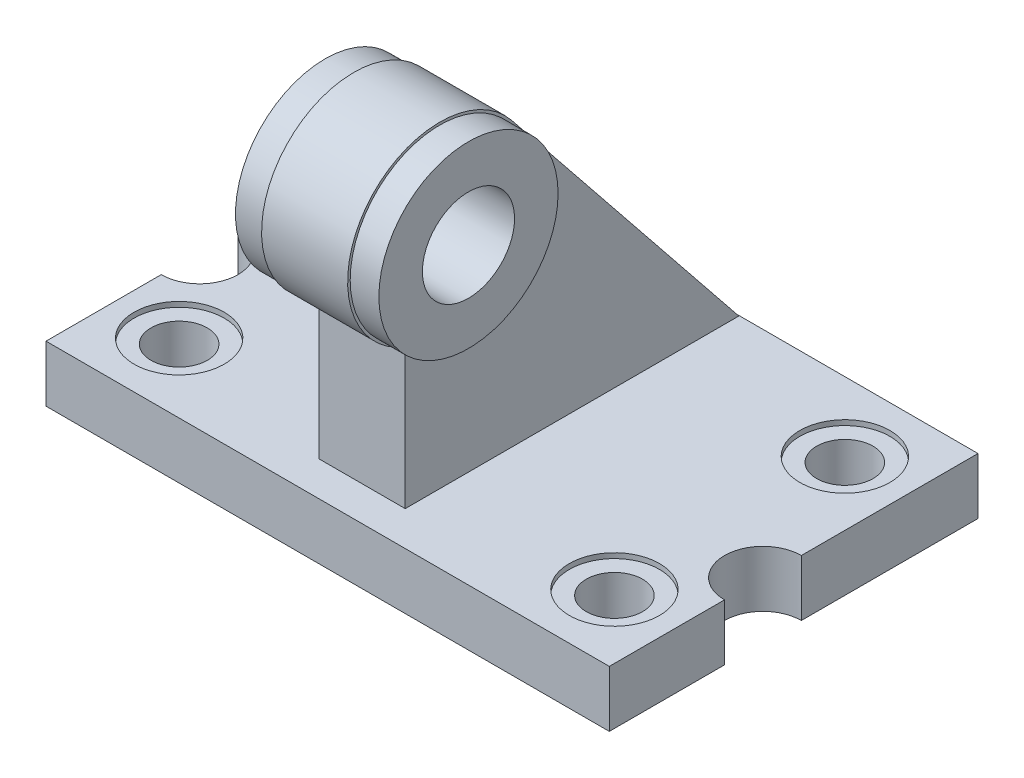
ISO-10303-21;
HEADER;
FILE_DESCRIPTION(('STEP AP214'),'2;1');
FILE_NAME('part.step','',(''),(''),'','','');
FILE_SCHEMA(('AUTOMOTIVE_DESIGN { 1 0 10303 214 1 1 1 1 }'));
ENDSEC;
DATA;
#1=APPLICATION_CONTEXT('core data for automotive mechanical design processes');
#2=APPLICATION_PROTOCOL_DEFINITION('international standard','automotive_design',2000,#1);
#3=PRODUCT_CONTEXT('',#1,'mechanical');
#4=PRODUCT('Part','Part','',(#3));
#5=PRODUCT_RELATED_PRODUCT_CATEGORY('part','',(#4));
#6=PRODUCT_DEFINITION_FORMATION('','',#4);
#7=PRODUCT_DEFINITION_CONTEXT('part definition',#1,'design');
#8=PRODUCT_DEFINITION('design','',#6,#7);
#9=PRODUCT_DEFINITION_SHAPE('','',#8);
#10=(LENGTH_UNIT() NAMED_UNIT(*) SI_UNIT(.MILLI.,.METRE.));
#11=(NAMED_UNIT(*) PLANE_ANGLE_UNIT() SI_UNIT($,.RADIAN.));
#12=(NAMED_UNIT(*) SI_UNIT($,.STERADIAN.) SOLID_ANGLE_UNIT());
#13=UNCERTAINTY_MEASURE_WITH_UNIT(LENGTH_MEASURE(1.E-05),#10,'distance_accuracy_value','');
#14=(GEOMETRIC_REPRESENTATION_CONTEXT(3) GLOBAL_UNCERTAINTY_ASSIGNED_CONTEXT((#13)) GLOBAL_UNIT_ASSIGNED_CONTEXT((#10,
#11,#12)) REPRESENTATION_CONTEXT('',''));
#15=CARTESIAN_POINT('',(0.,0.,0.));
#16=DIRECTION('',(0.,0.,1.));
#17=DIRECTION('',(1.,0.,0.));
#18=AXIS2_PLACEMENT_3D('',#15,#16,#17);
#19=CARTESIAN_POINT('',(-55.,0.,13.5));
#20=DIRECTION('',(0.,-1.,0.));
#21=DIRECTION('',(0.,0.,-1.));
#22=AXIS2_PLACEMENT_3D('',#19,#20,#21);
#23=PLANE('',#22);
#24=CARTESIAN_POINT('',(-42.5,0.,-45.));
#25=DIRECTION('',(0.,-1.,0.));
#26=DIRECTION('',(1.,0.,0.));
#27=AXIS2_PLACEMENT_3D('',#24,#25,#26);
#28=CIRCLE('',#27,5.5);
#29=CARTESIAN_POINT('',(-37.,0.,-45.));
#30=VERTEX_POINT('',#29);
#31=EDGE_CURVE('E224',#30,#30,#28,.F.);
#32=ORIENTED_EDGE('',*,*,#31,.T.);
#33=EDGE_LOOP('',(#32));
#34=FACE_BOUND('',#33,.T.);
#35=CARTESIAN_POINT('',(-42.5,0.,0.));
#36=DIRECTION('',(0.,-1.,0.));
#37=DIRECTION('',(1.,0.,0.));
#38=AXIS2_PLACEMENT_3D('',#35,#36,#37);
#39=CIRCLE('',#38,5.5);
#40=CARTESIAN_POINT('',(-37.,0.,0.));
#41=VERTEX_POINT('',#40);
#42=EDGE_CURVE('E221',#41,#41,#39,.F.);
#43=ORIENTED_EDGE('',*,*,#42,.T.);
#44=EDGE_LOOP('',(#43));
#45=FACE_BOUND('',#44,.T.);
#46=CARTESIAN_POINT('',(42.5,0.,0.));
#47=DIRECTION('',(0.,-1.,0.));
#48=DIRECTION('',(1.,0.,0.));
#49=AXIS2_PLACEMENT_3D('',#46,#47,#48);
#50=CIRCLE('',#49,5.5);
#51=CARTESIAN_POINT('',(48.,0.,0.));
#52=VERTEX_POINT('',#51);
#53=EDGE_CURVE('E218',#52,#52,#50,.F.);
#54=ORIENTED_EDGE('',*,*,#53,.T.);
#55=EDGE_LOOP('',(#54));
#56=FACE_BOUND('',#55,.T.);
#57=CARTESIAN_POINT('',(42.5,0.,-45.));
#58=DIRECTION('',(0.,-1.,0.));
#59=DIRECTION('',(1.,0.,0.));
#60=AXIS2_PLACEMENT_3D('',#57,#58,#59);
#61=CIRCLE('',#60,5.5);
#62=CARTESIAN_POINT('',(48.,0.,-45.));
#63=VERTEX_POINT('',#62);
#64=EDGE_CURVE('E215',#63,#63,#61,.F.);
#65=ORIENTED_EDGE('',*,*,#64,.T.);
#66=EDGE_LOOP('',(#65));
#67=FACE_BOUND('',#66,.T.);
#68=DIRECTION('',(0.,0.,1.));
#69=VECTOR('',#68,1.);
#70=CARTESIAN_POINT('',(-55.,0.,-22.5));
#71=LINE('',#70,#69);
#72=CARTESIAN_POINT('',(-55.,0.,-9.));
#73=VERTEX_POINT('',#72);
#74=CARTESIAN_POINT('',(-55.,0.,13.5));
#75=VERTEX_POINT('',#74);
#76=EDGE_CURVE('E134',#73,#75,#71,.T.);
#77=ORIENTED_EDGE('',*,*,#76,.F.);
#78=CARTESIAN_POINT('',(-55.,0.,-16.5));
#79=DIRECTION('',(0.,-1.,0.));
#80=DIRECTION('',(0.,0.,1.));
#81=AXIS2_PLACEMENT_3D('',#78,#79,#80);
#82=CIRCLE('',#81,7.5);
#83=CARTESIAN_POINT('',(-55.,0.,-24.));
#84=VERTEX_POINT('',#83);
#85=EDGE_CURVE('E122',#84,#73,#82,.T.);
#86=ORIENTED_EDGE('',*,*,#85,.F.);
#87=CARTESIAN_POINT('',(-55.,0.,-58.5));
#88=VERTEX_POINT('',#87);
#89=EDGE_CURVE('E142',#88,#84,#71,.T.);
#90=ORIENTED_EDGE('',*,*,#89,.F.);
#91=DIRECTION('',(-1.,0.,0.));
#92=VECTOR('',#91,1.);
#93=CARTESIAN_POINT('',(0.,0.,-58.5));
#94=LINE('',#93,#92);
#95=CARTESIAN_POINT('',(55.,0.,-58.5));
#96=VERTEX_POINT('',#95);
#97=EDGE_CURVE('E262',#96,#88,#94,.T.);
#98=ORIENTED_EDGE('',*,*,#97,.F.);
#99=DIRECTION('',(0.,0.,-1.));
#100=VECTOR('',#99,1.);
#101=CARTESIAN_POINT('',(55.,0.,-22.5));
#102=LINE('',#101,#100);
#103=CARTESIAN_POINT('',(55.,0.,-24.));
#104=VERTEX_POINT('',#103);
#105=EDGE_CURVE('E269',#104,#96,#102,.T.);
#106=ORIENTED_EDGE('',*,*,#105,.F.);
#107=CARTESIAN_POINT('',(55.,0.,-16.5));
#108=DIRECTION('',(0.,1.,0.));
#109=DIRECTION('',(0.,0.,1.));
#110=AXIS2_PLACEMENT_3D('',#107,#108,#109);
#111=CIRCLE('',#110,7.5);
#112=CARTESIAN_POINT('',(55.,0.,-9.));
#113=VERTEX_POINT('',#112);
#114=EDGE_CURVE('E137',#104,#113,#111,.T.);
#115=ORIENTED_EDGE('',*,*,#114,.T.);
#116=CARTESIAN_POINT('',(55.,0.,13.5));
#117=VERTEX_POINT('',#116);
#118=EDGE_CURVE('E240',#117,#113,#102,.T.);
#119=ORIENTED_EDGE('',*,*,#118,.F.);
#120=DIRECTION('',(1.,0.,0.));
#121=VECTOR('',#120,1.);
#122=CARTESIAN_POINT('',(0.,0.,13.5));
#123=LINE('',#122,#121);
#124=EDGE_CURVE('E140',#75,#117,#123,.T.);
#125=ORIENTED_EDGE('',*,*,#124,.F.);
#126=EDGE_LOOP('',(#77,#86,#90,#98,#106,#115,#119,#125));
#127=FACE_BOUND('',#126,.T.);
#128=ADVANCED_FACE('F36',(#34,#45,#56,#67,#127),#23,.T.);
#129=CARTESIAN_POINT('',(-55.,0.,-58.5));
#130=DIRECTION('',(-1.,0.,0.));
#131=DIRECTION('',(0.,0.,1.));
#132=AXIS2_PLACEMENT_3D('',#129,#130,#131);
#133=PLANE('',#132);
#134=DIRECTION('',(0.,0.,1.));
#135=VECTOR('',#134,1.);
#136=CARTESIAN_POINT('',(-55.,11.,-22.5));
#137=LINE('',#136,#135);
#138=CARTESIAN_POINT('',(-55.,11.,-9.));
#139=VERTEX_POINT('',#138);
#140=CARTESIAN_POINT('',(-55.,11.,13.5));
#141=VERTEX_POINT('',#140);
#142=EDGE_CURVE('E136',#139,#141,#137,.T.);
#143=ORIENTED_EDGE('',*,*,#142,.F.);
#144=DIRECTION('',(0.,1.,0.));
#145=VECTOR('',#144,1.);
#146=CARTESIAN_POINT('',(-55.,0.,-9.));
#147=LINE('',#146,#145);
#148=EDGE_CURVE('E51',#139,#73,#147,.F.);
#149=ORIENTED_EDGE('',*,*,#148,.T.);
#150=ORIENTED_EDGE('',*,*,#76,.T.);
#151=DIRECTION('',(0.,1.,0.));
#152=VECTOR('',#151,1.);
#153=CARTESIAN_POINT('',(-55.,0.,13.5));
#154=LINE('',#153,#152);
#155=EDGE_CURVE('E145',#141,#75,#154,.F.);
#156=ORIENTED_EDGE('',*,*,#155,.F.);
#157=EDGE_LOOP('',(#143,#149,#150,#156));
#158=FACE_BOUND('',#157,.T.);
#159=ADVANCED_FACE('F132',(#158),#133,.T.);
#160=ORIENTED_EDGE('',*,*,#89,.T.);
#161=DIRECTION('',(0.,1.,0.));
#162=VECTOR('',#161,1.);
#163=CARTESIAN_POINT('',(-55.,0.,-24.));
#164=LINE('',#163,#162);
#165=CARTESIAN_POINT('',(-55.,11.,-24.));
#166=VERTEX_POINT('',#165);
#167=EDGE_CURVE('E125',#84,#166,#164,.T.);
#168=ORIENTED_EDGE('',*,*,#167,.T.);
#169=CARTESIAN_POINT('',(-55.,11.,-58.5));
#170=VERTEX_POINT('',#169);
#171=EDGE_CURVE('E253',#170,#166,#137,.T.);
#172=ORIENTED_EDGE('',*,*,#171,.F.);
#173=DIRECTION('',(0.,1.,0.));
#174=VECTOR('',#173,1.);
#175=CARTESIAN_POINT('',(-55.,0.,-58.5));
#176=LINE('',#175,#174);
#177=EDGE_CURVE('E202',#88,#170,#176,.T.);
#178=ORIENTED_EDGE('',*,*,#177,.F.);
#179=EDGE_LOOP('',(#160,#168,#172,#178));
#180=FACE_BOUND('',#179,.T.);
#181=ADVANCED_FACE('F293',(#180),#133,.T.);
#182=CARTESIAN_POINT('',(-55.,11.,-58.5));
#183=DIRECTION('',(0.,1.,0.));
#184=DIRECTION('',(0.,0.,1.));
#185=AXIS2_PLACEMENT_3D('',#182,#183,#184);
#186=PLANE('',#185);
#187=CARTESIAN_POINT('',(-42.5,11.,-45.));
#188=DIRECTION('',(0.,-1.,0.));
#189=DIRECTION('',(0.,0.,-1.));
#190=AXIS2_PLACEMENT_3D('',#187,#188,#189);
#191=CIRCLE('',#190,8.80000000000003);
#192=CARTESIAN_POINT('',(-42.5,11.,-53.8));
#193=VERTEX_POINT('',#192);
#194=EDGE_CURVE('E181',#193,#193,#191,.T.);
#195=ORIENTED_EDGE('',*,*,#194,.T.);
#196=EDGE_LOOP('',(#195));
#197=FACE_BOUND('',#196,.T.);
#198=CARTESIAN_POINT('',(-42.5,11.,0.));
#199=DIRECTION('',(0.,-1.,0.));
#200=DIRECTION('',(0.,0.,-1.));
#201=AXIS2_PLACEMENT_3D('',#198,#199,#200);
#202=CIRCLE('',#201,8.80000000000001);
#203=CARTESIAN_POINT('',(-42.5,11.,-8.80000000000001));
#204=VERTEX_POINT('',#203);
#205=EDGE_CURVE('E178',#204,#204,#202,.T.);
#206=ORIENTED_EDGE('',*,*,#205,.T.);
#207=EDGE_LOOP('',(#206));
#208=FACE_BOUND('',#207,.T.);
#209=CARTESIAN_POINT('',(42.5,11.,0.));
#210=DIRECTION('',(0.,-1.,0.));
#211=DIRECTION('',(0.,0.,-1.));
#212=AXIS2_PLACEMENT_3D('',#209,#210,#211);
#213=CIRCLE('',#212,8.80000000000001);
#214=CARTESIAN_POINT('',(42.5,11.,-8.80000000000001));
#215=VERTEX_POINT('',#214);
#216=EDGE_CURVE('E175',#215,#215,#213,.T.);
#217=ORIENTED_EDGE('',*,*,#216,.T.);
#218=EDGE_LOOP('',(#217));
#219=FACE_BOUND('',#218,.T.);
#220=CARTESIAN_POINT('',(42.5,11.,-45.));
#221=DIRECTION('',(0.,-1.,0.));
#222=DIRECTION('',(0.,0.,-1.));
#223=AXIS2_PLACEMENT_3D('',#220,#221,#222);
#224=CIRCLE('',#223,8.80000000000003);
#225=CARTESIAN_POINT('',(42.5,11.,-53.8));
#226=VERTEX_POINT('',#225);
#227=EDGE_CURVE('E172',#226,#226,#224,.T.);
#228=ORIENTED_EDGE('',*,*,#227,.T.);
#229=EDGE_LOOP('',(#228));
#230=FACE_BOUND('',#229,.T.);
#231=DIRECTION('',(-1.,0.,0.));
#232=VECTOR('',#231,1.);
#233=CARTESIAN_POINT('',(8.4,11.,6.74999999999999));
#234=LINE('',#233,#232);
#235=CARTESIAN_POINT('',(-8.4,11.,6.74999999999999));
#236=VERTEX_POINT('',#235);
#237=CARTESIAN_POINT('',(8.4,11.,6.75));
#238=VERTEX_POINT('',#237);
#239=EDGE_CURVE('E165',#236,#238,#234,.F.);
#240=ORIENTED_EDGE('',*,*,#239,.F.);
#241=DIRECTION('',(0.,0.,1.));
#242=VECTOR('',#241,1.);
#243=CARTESIAN_POINT('',(-8.4,11.,-19.818));
#244=LINE('',#243,#242);
#245=CARTESIAN_POINT('',(-8.4,11.,-58.4));
#246=VERTEX_POINT('',#245);
#247=EDGE_CURVE('E255',#246,#236,#244,.T.);
#248=ORIENTED_EDGE('',*,*,#247,.F.);
#249=DIRECTION('',(-1.,0.,0.));
#250=VECTOR('',#249,1.);
#251=CARTESIAN_POINT('',(8.4,11.,-58.4));
#252=LINE('',#251,#250);
#253=CARTESIAN_POINT('',(8.4,11.,-58.4));
#254=VERTEX_POINT('',#253);
#255=EDGE_CURVE('E171',#254,#246,#252,.T.);
#256=ORIENTED_EDGE('',*,*,#255,.F.);
#257=DIRECTION('',(0.,0.,-1.));
#258=VECTOR('',#257,1.);
#259=CARTESIAN_POINT('',(8.4,11.,-19.818));
#260=LINE('',#259,#258);
#261=EDGE_CURVE('E348',#238,#254,#260,.T.);
#262=ORIENTED_EDGE('',*,*,#261,.F.);
#263=EDGE_LOOP('',(#240,#248,#256,#262));
#264=FACE_BOUND('',#263,.T.);
#265=ORIENTED_EDGE('',*,*,#171,.T.);
#266=CARTESIAN_POINT('',(-55.,11.,-16.5));
#267=DIRECTION('',(0.,1.,0.));
#268=DIRECTION('',(0.,0.,1.));
#269=AXIS2_PLACEMENT_3D('',#266,#267,#268);
#270=CIRCLE('',#269,7.5);
#271=EDGE_CURVE('E11',#166,#139,#270,.F.);
#272=ORIENTED_EDGE('',*,*,#271,.T.);
#273=ORIENTED_EDGE('',*,*,#142,.T.);
#274=DIRECTION('',(1.,0.,0.));
#275=VECTOR('',#274,1.);
#276=CARTESIAN_POINT('',(-55.,11.,13.5));
#277=LINE('',#276,#275);
#278=CARTESIAN_POINT('',(55.,11.,13.5));
#279=VERTEX_POINT('',#278);
#280=EDGE_CURVE('E245',#141,#279,#277,.T.);
#281=ORIENTED_EDGE('',*,*,#280,.T.);
#282=DIRECTION('',(0.,0.,-1.));
#283=VECTOR('',#282,1.);
#284=CARTESIAN_POINT('',(55.,11.,-22.5));
#285=LINE('',#284,#283);
#286=CARTESIAN_POINT('',(55.,11.,-9.));
#287=VERTEX_POINT('',#286);
#288=EDGE_CURVE('E238',#279,#287,#285,.T.);
#289=ORIENTED_EDGE('',*,*,#288,.T.);
#290=CARTESIAN_POINT('',(55.,11.,-16.5));
#291=DIRECTION('',(0.,1.,0.));
#292=DIRECTION('',(0.,0.,1.));
#293=AXIS2_PLACEMENT_3D('',#290,#291,#292);
#294=CIRCLE('',#293,7.5);
#295=CARTESIAN_POINT('',(55.,11.,-24.));
#296=VERTEX_POINT('',#295);
#297=EDGE_CURVE('E44',#296,#287,#294,.T.);
#298=ORIENTED_EDGE('',*,*,#297,.F.);
#299=CARTESIAN_POINT('',(55.,11.,-58.5));
#300=VERTEX_POINT('',#299);
#301=EDGE_CURVE('E246',#296,#300,#285,.T.);
#302=ORIENTED_EDGE('',*,*,#301,.T.);
#303=DIRECTION('',(1.,0.,0.));
#304=VECTOR('',#303,1.);
#305=CARTESIAN_POINT('',(-55.,11.,-58.5));
#306=LINE('',#305,#304);
#307=EDGE_CURVE('E184',#300,#170,#306,.F.);
#308=ORIENTED_EDGE('',*,*,#307,.T.);
#309=EDGE_LOOP('',(#265,#272,#273,#281,#289,#298,#302,#308));
#310=FACE_BOUND('',#309,.T.);
#311=ADVANCED_FACE('F243',(#197,#208,#219,#230,#264,#310),#186,.T.);
#312=CARTESIAN_POINT('',(55.,0.,13.5));
#313=DIRECTION('',(1.,0.,0.));
#314=DIRECTION('',(0.,0.,-1.));
#315=AXIS2_PLACEMENT_3D('',#312,#313,#314);
#316=PLANE('',#315);
#317=DIRECTION('',(0.,1.,0.));
#318=VECTOR('',#317,1.);
#319=CARTESIAN_POINT('',(55.,0.,-24.));
#320=LINE('',#319,#318);
#321=EDGE_CURVE('E58',#104,#296,#320,.T.);
#322=ORIENTED_EDGE('',*,*,#321,.F.);
#323=ORIENTED_EDGE('',*,*,#105,.T.);
#324=DIRECTION('',(0.,1.,0.));
#325=VECTOR('',#324,1.);
#326=CARTESIAN_POINT('',(55.,0.,-58.5));
#327=LINE('',#326,#325);
#328=EDGE_CURVE('E265',#300,#96,#327,.F.);
#329=ORIENTED_EDGE('',*,*,#328,.F.);
#330=ORIENTED_EDGE('',*,*,#301,.F.);
#331=EDGE_LOOP('',(#322,#323,#329,#330));
#332=FACE_BOUND('',#331,.T.);
#333=ADVANCED_FACE('F282',(#332),#316,.T.);
#334=CARTESIAN_POINT('',(-42.5,10.,-45.));
#335=DIRECTION('',(0.,-1.,0.));
#336=DIRECTION('',(1.,0.,0.));
#337=AXIS2_PLACEMENT_3D('',#334,#335,#336);
#338=CYLINDRICAL_SURFACE('',#337,5.5);
#339=CARTESIAN_POINT('',(-42.5,10.,-45.));
#340=DIRECTION('',(0.,-1.,0.));
#341=DIRECTION('',(1.,0.,0.));
#342=AXIS2_PLACEMENT_3D('',#339,#340,#341);
#343=CIRCLE('',#342,5.5);
#344=CARTESIAN_POINT('',(-37.,10.,-45.));
#345=VERTEX_POINT('',#344);
#346=EDGE_CURVE('E212',#345,#345,#343,.T.);
#347=ORIENTED_EDGE('',*,*,#346,.F.);
#348=EDGE_LOOP('',(#347));
#349=FACE_BOUND('',#348,.T.);
#350=ORIENTED_EDGE('',*,*,#31,.F.);
#351=EDGE_LOOP('',(#350));
#352=FACE_BOUND('',#351,.T.);
#353=ADVANCED_FACE('F38',(#349,#352),#338,.F.);
#354=CARTESIAN_POINT('',(-42.5,10.,0.));
#355=DIRECTION('',(0.,-1.,0.));
#356=DIRECTION('',(1.,0.,0.));
#357=AXIS2_PLACEMENT_3D('',#354,#355,#356);
#358=CYLINDRICAL_SURFACE('',#357,5.5);
#359=CARTESIAN_POINT('',(-42.5,10.,0.));
#360=DIRECTION('',(0.,-1.,0.));
#361=DIRECTION('',(1.,0.,0.));
#362=AXIS2_PLACEMENT_3D('',#359,#360,#361);
#363=CIRCLE('',#362,5.5);
#364=CARTESIAN_POINT('',(-37.,10.,0.));
#365=VERTEX_POINT('',#364);
#366=EDGE_CURVE('E209',#365,#365,#363,.T.);
#367=ORIENTED_EDGE('',*,*,#366,.F.);
#368=EDGE_LOOP('',(#367));
#369=FACE_BOUND('',#368,.T.);
#370=ORIENTED_EDGE('',*,*,#42,.F.);
#371=EDGE_LOOP('',(#370));
#372=FACE_BOUND('',#371,.T.);
#373=ADVANCED_FACE('F305',(#369,#372),#358,.F.);
#374=CARTESIAN_POINT('',(42.5,10.,0.));
#375=DIRECTION('',(0.,-1.,0.));
#376=DIRECTION('',(1.,0.,0.));
#377=AXIS2_PLACEMENT_3D('',#374,#375,#376);
#378=CYLINDRICAL_SURFACE('',#377,5.5);
#379=CARTESIAN_POINT('',(42.5,10.,0.));
#380=DIRECTION('',(0.,-1.,0.));
#381=DIRECTION('',(1.,0.,0.));
#382=AXIS2_PLACEMENT_3D('',#379,#380,#381);
#383=CIRCLE('',#382,5.5);
#384=CARTESIAN_POINT('',(48.,10.,0.));
#385=VERTEX_POINT('',#384);
#386=EDGE_CURVE('E206',#385,#385,#383,.T.);
#387=ORIENTED_EDGE('',*,*,#386,.F.);
#388=EDGE_LOOP('',(#387));
#389=FACE_BOUND('',#388,.T.);
#390=ORIENTED_EDGE('',*,*,#53,.F.);
#391=EDGE_LOOP('',(#390));
#392=FACE_BOUND('',#391,.T.);
#393=ADVANCED_FACE('F302',(#389,#392),#378,.F.);
#394=CARTESIAN_POINT('',(42.5,10.,-45.));
#395=DIRECTION('',(0.,-1.,0.));
#396=DIRECTION('',(1.,0.,0.));
#397=AXIS2_PLACEMENT_3D('',#394,#395,#396);
#398=CYLINDRICAL_SURFACE('',#397,5.5);
#399=CARTESIAN_POINT('',(42.5,10.,-45.));
#400=DIRECTION('',(0.,-1.,0.));
#401=DIRECTION('',(1.,0.,0.));
#402=AXIS2_PLACEMENT_3D('',#399,#400,#401);
#403=CIRCLE('',#402,5.5);
#404=CARTESIAN_POINT('',(48.,10.,-45.));
#405=VERTEX_POINT('',#404);
#406=EDGE_CURVE('E147',#405,#405,#403,.T.);
#407=ORIENTED_EDGE('',*,*,#406,.F.);
#408=EDGE_LOOP('',(#407));
#409=FACE_BOUND('',#408,.T.);
#410=ORIENTED_EDGE('',*,*,#64,.F.);
#411=EDGE_LOOP('',(#410));
#412=FACE_BOUND('',#411,.T.);
#413=ADVANCED_FACE('F299',(#409,#412),#398,.F.);
#414=CARTESIAN_POINT('',(-33.5943978918289,10.,-36.1999999999999));
#415=DIRECTION('',(0.,1.,0.));
#416=DIRECTION('',(0.,0.,-1.));
#417=AXIS2_PLACEMENT_3D('',#414,#415,#416);
#418=PLANE('',#417);
#419=ORIENTED_EDGE('',*,*,#346,.T.);
#420=EDGE_LOOP('',(#419));
#421=FACE_BOUND('',#420,.T.);
#422=CARTESIAN_POINT('',(-42.5,10.,-45.));
#423=DIRECTION('',(0.,-1.,0.));
#424=DIRECTION('',(0.,0.,-1.));
#425=AXIS2_PLACEMENT_3D('',#422,#423,#424);
#426=CIRCLE('',#425,8.80000000000003);
#427=CARTESIAN_POINT('',(-42.5,10.,-53.8));
#428=VERTEX_POINT('',#427);
#429=EDGE_CURVE('E200',#428,#428,#426,.T.);
#430=ORIENTED_EDGE('',*,*,#429,.F.);
#431=EDGE_LOOP('',(#430));
#432=FACE_BOUND('',#431,.T.);
#433=ADVANCED_FACE('F297',(#421,#432),#418,.T.);
#434=CARTESIAN_POINT('',(-33.5943978917141,10.,8.80000000000001));
#435=DIRECTION('',(0.,1.,0.));
#436=DIRECTION('',(0.,0.,-1.));
#437=AXIS2_PLACEMENT_3D('',#434,#435,#436);
#438=PLANE('',#437);
#439=ORIENTED_EDGE('',*,*,#366,.T.);
#440=EDGE_LOOP('',(#439));
#441=FACE_BOUND('',#440,.T.);
#442=CARTESIAN_POINT('',(-42.5,10.,0.));
#443=DIRECTION('',(0.,-1.,0.));
#444=DIRECTION('',(0.,0.,-1.));
#445=AXIS2_PLACEMENT_3D('',#442,#443,#444);
#446=CIRCLE('',#445,8.80000000000001);
#447=CARTESIAN_POINT('',(-42.5,10.,-8.80000000000001));
#448=VERTEX_POINT('',#447);
#449=EDGE_CURVE('E197',#448,#448,#446,.T.);
#450=ORIENTED_EDGE('',*,*,#449,.F.);
#451=EDGE_LOOP('',(#450));
#452=FACE_BOUND('',#451,.T.);
#453=ADVANCED_FACE('F323',(#441,#452),#438,.T.);
#454=CARTESIAN_POINT('',(51.4056021082859,10.,8.80000000000001));
#455=DIRECTION('',(0.,1.,0.));
#456=DIRECTION('',(0.,0.,-1.));
#457=AXIS2_PLACEMENT_3D('',#454,#455,#456);
#458=PLANE('',#457);
#459=ORIENTED_EDGE('',*,*,#386,.T.);
#460=EDGE_LOOP('',(#459));
#461=FACE_BOUND('',#460,.T.);
#462=CARTESIAN_POINT('',(42.5,10.,0.));
#463=DIRECTION('',(0.,-1.,0.));
#464=DIRECTION('',(0.,0.,-1.));
#465=AXIS2_PLACEMENT_3D('',#462,#463,#464);
#466=CIRCLE('',#465,8.80000000000001);
#467=CARTESIAN_POINT('',(42.5,10.,-8.80000000000001));
#468=VERTEX_POINT('',#467);
#469=EDGE_CURVE('E194',#468,#468,#466,.T.);
#470=ORIENTED_EDGE('',*,*,#469,.F.);
#471=EDGE_LOOP('',(#470));
#472=FACE_BOUND('',#471,.T.);
#473=ADVANCED_FACE('F326',(#461,#472),#458,.T.);
#474=CARTESIAN_POINT('',(51.4056021083432,10.,-36.1999999999999));
#475=DIRECTION('',(0.,1.,0.));
#476=DIRECTION('',(0.,0.,-1.));
#477=AXIS2_PLACEMENT_3D('',#474,#475,#476);
#478=PLANE('',#477);
#479=ORIENTED_EDGE('',*,*,#406,.T.);
#480=EDGE_LOOP('',(#479));
#481=FACE_BOUND('',#480,.T.);
#482=CARTESIAN_POINT('',(42.5,10.,-45.));
#483=DIRECTION('',(0.,-1.,0.));
#484=DIRECTION('',(0.,0.,-1.));
#485=AXIS2_PLACEMENT_3D('',#482,#483,#484);
#486=CIRCLE('',#485,8.80000000000003);
#487=CARTESIAN_POINT('',(42.5,10.,-53.8));
#488=VERTEX_POINT('',#487);
#489=EDGE_CURVE('E191',#488,#488,#486,.T.);
#490=ORIENTED_EDGE('',*,*,#489,.F.);
#491=EDGE_LOOP('',(#490));
#492=FACE_BOUND('',#491,.T.);
#493=ADVANCED_FACE('F527',(#481,#492),#478,.T.);
#494=CARTESIAN_POINT('',(14.,55.,0.));
#495=DIRECTION('',(-1.,0.,0.));
#496=DIRECTION('',(0.,-1.,0.));
#497=AXIS2_PLACEMENT_3D('',#494,#495,#496);
#498=CYLINDRICAL_SURFACE('',#497,9.);
#499=CARTESIAN_POINT('',(-14.,55.,0.));
#500=DIRECTION('',(-1.,0.,0.));
#501=DIRECTION('',(0.,-1.,0.));
#502=AXIS2_PLACEMENT_3D('',#499,#500,#501);
#503=CIRCLE('',#502,9.);
#504=CARTESIAN_POINT('',(-14.,46.,0.));
#505=VERTEX_POINT('',#504);
#506=EDGE_CURVE('E143',#505,#505,#503,.F.);
#507=ORIENTED_EDGE('',*,*,#506,.F.);
#508=EDGE_LOOP('',(#507));
#509=FACE_BOUND('',#508,.T.);
#510=CARTESIAN_POINT('',(14.,55.,0.));
#511=DIRECTION('',(-1.,0.,0.));
#512=DIRECTION('',(0.,-1.,0.));
#513=AXIS2_PLACEMENT_3D('',#510,#511,#512);
#514=CIRCLE('',#513,9.);
#515=CARTESIAN_POINT('',(14.,46.,0.));
#516=VERTEX_POINT('',#515);
#517=EDGE_CURVE('E188',#516,#516,#514,.T.);
#518=ORIENTED_EDGE('',*,*,#517,.F.);
#519=EDGE_LOOP('',(#518));
#520=FACE_BOUND('',#519,.T.);
#521=ADVANCED_FACE('F283',(#509,#520),#498,.F.);
#522=CARTESIAN_POINT('',(-14.,37.289997891851,-17.5));
#523=DIRECTION('',(-1.,0.,0.));
#524=DIRECTION('',(0.,0.,1.));
#525=AXIS2_PLACEMENT_3D('',#522,#523,#524);
#526=PLANE('',#525);
#527=ORIENTED_EDGE('',*,*,#506,.T.);
#528=EDGE_LOOP('',(#527));
#529=FACE_BOUND('',#528,.T.);
#530=CARTESIAN_POINT('',(-14.,55.,0.));
#531=DIRECTION('',(-1.,0.,0.));
#532=DIRECTION('',(0.,-1.,0.));
#533=AXIS2_PLACEMENT_3D('',#530,#531,#532);
#534=CIRCLE('',#533,17.5);
#535=CARTESIAN_POINT('',(-14.,37.5,0.));
#536=VERTEX_POINT('',#535);
#537=EDGE_CURVE('E185',#536,#536,#534,.F.);
#538=ORIENTED_EDGE('',*,*,#537,.F.);
#539=EDGE_LOOP('',(#538));
#540=FACE_BOUND('',#539,.T.);
#541=ADVANCED_FACE('F274',(#529,#540),#526,.T.);
#542=CARTESIAN_POINT('',(-55.,0.,13.5));
#543=DIRECTION('',(0.,0.,1.));
#544=DIRECTION('',(1.,0.,0.));
#545=AXIS2_PLACEMENT_3D('',#542,#543,#544);
#546=PLANE('',#545);
#547=ORIENTED_EDGE('',*,*,#124,.T.);
#548=DIRECTION('',(0.,1.,0.));
#549=VECTOR('',#548,1.);
#550=CARTESIAN_POINT('',(55.,0.,13.5));
#551=LINE('',#550,#549);
#552=EDGE_CURVE('E270',#279,#117,#551,.F.);
#553=ORIENTED_EDGE('',*,*,#552,.F.);
#554=ORIENTED_EDGE('',*,*,#280,.F.);
#555=ORIENTED_EDGE('',*,*,#155,.T.);
#556=EDGE_LOOP('',(#547,#553,#554,#555));
#557=FACE_BOUND('',#556,.T.);
#558=ADVANCED_FACE('F272',(#557),#546,.T.);
#559=DIRECTION('',(0.,1.,0.));
#560=VECTOR('',#559,1.);
#561=CARTESIAN_POINT('',(55.,0.,-9.));
#562=LINE('',#561,#560);
#563=EDGE_CURVE('E228',#287,#113,#562,.F.);
#564=ORIENTED_EDGE('',*,*,#563,.F.);
#565=ORIENTED_EDGE('',*,*,#288,.F.);
#566=ORIENTED_EDGE('',*,*,#552,.T.);
#567=ORIENTED_EDGE('',*,*,#118,.T.);
#568=EDGE_LOOP('',(#564,#565,#566,#567));
#569=FACE_BOUND('',#568,.T.);
#570=ADVANCED_FACE('F236',(#569),#316,.T.);
#571=CARTESIAN_POINT('',(55.,0.,-58.5));
#572=DIRECTION('',(0.,0.,-1.));
#573=DIRECTION('',(-1.,0.,0.));
#574=AXIS2_PLACEMENT_3D('',#571,#572,#573);
#575=PLANE('',#574);
#576=ORIENTED_EDGE('',*,*,#97,.T.);
#577=ORIENTED_EDGE('',*,*,#177,.T.);
#578=ORIENTED_EDGE('',*,*,#307,.F.);
#579=ORIENTED_EDGE('',*,*,#328,.T.);
#580=EDGE_LOOP('',(#576,#577,#578,#579));
#581=FACE_BOUND('',#580,.T.);
#582=ADVANCED_FACE('F280',(#581),#575,.T.);
#583=CARTESIAN_POINT('',(-42.5,11.,-45.));
#584=DIRECTION('',(0.,-1.,0.));
#585=DIRECTION('',(0.,0.,-1.));
#586=AXIS2_PLACEMENT_3D('',#583,#584,#585);
#587=CYLINDRICAL_SURFACE('',#586,8.80000000000003);
#588=ORIENTED_EDGE('',*,*,#429,.T.);
#589=EDGE_LOOP('',(#588));
#590=FACE_BOUND('',#589,.T.);
#591=ORIENTED_EDGE('',*,*,#194,.F.);
#592=EDGE_LOOP('',(#591));
#593=FACE_BOUND('',#592,.T.);
#594=ADVANCED_FACE('F333',(#590,#593),#587,.F.);
#595=CARTESIAN_POINT('',(-42.5,11.,0.));
#596=DIRECTION('',(0.,-1.,0.));
#597=DIRECTION('',(0.,0.,-1.));
#598=AXIS2_PLACEMENT_3D('',#595,#596,#597);
#599=CYLINDRICAL_SURFACE('',#598,8.80000000000001);
#600=ORIENTED_EDGE('',*,*,#449,.T.);
#601=EDGE_LOOP('',(#600));
#602=FACE_BOUND('',#601,.T.);
#603=ORIENTED_EDGE('',*,*,#205,.F.);
#604=EDGE_LOOP('',(#603));
#605=FACE_BOUND('',#604,.T.);
#606=ADVANCED_FACE('F329',(#602,#605),#599,.F.);
#607=CARTESIAN_POINT('',(42.5,11.,0.));
#608=DIRECTION('',(0.,-1.,0.));
#609=DIRECTION('',(0.,0.,-1.));
#610=AXIS2_PLACEMENT_3D('',#607,#608,#609);
#611=CYLINDRICAL_SURFACE('',#610,8.80000000000001);
#612=ORIENTED_EDGE('',*,*,#469,.T.);
#613=EDGE_LOOP('',(#612));
#614=FACE_BOUND('',#613,.T.);
#615=ORIENTED_EDGE('',*,*,#216,.F.);
#616=EDGE_LOOP('',(#615));
#617=FACE_BOUND('',#616,.T.);
#618=ADVANCED_FACE('F332',(#614,#617),#611,.F.);
#619=CARTESIAN_POINT('',(42.5,11.,-45.));
#620=DIRECTION('',(0.,-1.,0.));
#621=DIRECTION('',(0.,0.,-1.));
#622=AXIS2_PLACEMENT_3D('',#619,#620,#621);
#623=CYLINDRICAL_SURFACE('',#622,8.80000000000003);
#624=ORIENTED_EDGE('',*,*,#489,.T.);
#625=EDGE_LOOP('',(#624));
#626=FACE_BOUND('',#625,.T.);
#627=ORIENTED_EDGE('',*,*,#227,.F.);
#628=EDGE_LOOP('',(#627));
#629=FACE_BOUND('',#628,.T.);
#630=ADVANCED_FACE('F401',(#626,#629),#623,.F.);
#631=CARTESIAN_POINT('',(14.,37.289997891851,17.5));
#632=DIRECTION('',(1.,0.,0.));
#633=DIRECTION('',(0.,0.,-1.));
#634=AXIS2_PLACEMENT_3D('',#631,#632,#633);
#635=PLANE('',#634);
#636=ORIENTED_EDGE('',*,*,#517,.T.);
#637=EDGE_LOOP('',(#636));
#638=FACE_BOUND('',#637,.T.);
#639=CARTESIAN_POINT('',(14.,55.,0.));
#640=DIRECTION('',(-1.,0.,0.));
#641=DIRECTION('',(0.,0.,1.));
#642=AXIS2_PLACEMENT_3D('',#639,#640,#641);
#643=CIRCLE('',#642,17.5);
#644=CARTESIAN_POINT('',(14.,55.,17.5));
#645=VERTEX_POINT('',#644);
#646=EDGE_CURVE('E167',#645,#645,#643,.T.);
#647=ORIENTED_EDGE('',*,*,#646,.F.);
#648=EDGE_LOOP('',(#647));
#649=FACE_BOUND('',#648,.T.);
#650=ADVANCED_FACE('F397',(#638,#649),#635,.T.);
#651=CARTESIAN_POINT('',(-14.,55.,0.));
#652=DIRECTION('',(-1.,0.,0.));
#653=DIRECTION('',(0.,-1.,0.));
#654=AXIS2_PLACEMENT_3D('',#651,#652,#653);
#655=CYLINDRICAL_SURFACE('',#654,17.5);
#656=ORIENTED_EDGE('',*,*,#537,.T.);
#657=EDGE_LOOP('',(#656));
#658=FACE_BOUND('',#657,.T.);
#659=CARTESIAN_POINT('',(-8.4,55.,0.));
#660=DIRECTION('',(-1.,0.,0.));
#661=DIRECTION('',(0.,-1.,0.));
#662=AXIS2_PLACEMENT_3D('',#659,#660,#661);
#663=CIRCLE('',#662,17.5);
#664=CARTESIAN_POINT('',(-8.4,37.5,0.));
#665=VERTEX_POINT('',#664);
#666=EDGE_CURVE('E162',#665,#665,#663,.F.);
#667=ORIENTED_EDGE('',*,*,#666,.F.);
#668=EDGE_LOOP('',(#667));
#669=FACE_BOUND('',#668,.T.);
#670=ADVANCED_FACE('F392',(#658,#669),#655,.T.);
#671=CARTESIAN_POINT('',(8.4,66.2675378169935,-14.0371860265019));
#672=DIRECTION('',(0.,0.625974323166305,-0.779843668138997));
#673=DIRECTION('',(0.,-0.779843668138997,-0.625974323166305));
#674=AXIS2_PLACEMENT_3D('',#671,#672,#673);
#675=PLANE('',#674);
#676=CARTESIAN_POINT('',(8.4,11.,-58.4));
#677=CARTESIAN_POINT('',(8.4,13.3028140757081,-56.5515494177709));
#678=CARTESIAN_POINT('',(8.4,15.6056281514161,-54.7030988355418));
#679=CARTESIAN_POINT('',(8.4,20.2112563028322,-51.0061976710837));
#680=CARTESIAN_POINT('',(8.4,22.5140703785403,-49.1577470888546));
#681=CARTESIAN_POINT('',(8.4,27.1196985299564,-45.4608459243964));
#682=CARTESIAN_POINT('',(8.4,29.4225126056645,-43.6123953421673));
#683=CARTESIAN_POINT('',(8.4,34.0281407570806,-39.9154941777091));
#684=CARTESIAN_POINT('',(8.4,36.3309548327887,-38.0670435954801));
#685=CARTESIAN_POINT('',(8.4,40.9365829842048,-34.3701424310219));
#686=CARTESIAN_POINT('',(8.4,43.2393970599129,-32.5216918487928));
#687=CARTESIAN_POINT('',(8.4,47.845025211329,-28.8247906843346));
#688=CARTESIAN_POINT('',(8.4,50.147839287037,-26.9763401021055));
#689=CARTESIAN_POINT('',(8.4,54.7534674384532,-23.2794389376474));
#690=CARTESIAN_POINT('',(8.4,57.0562815141612,-21.4309883554183));
#691=CARTESIAN_POINT('',(8.4,61.6619096655774,-17.7340871909601));
#692=CARTESIAN_POINT('',(8.4,63.9647237412854,-15.885636608731));
#693=CARTESIAN_POINT('',(8.4,66.2675378169935,-14.0371860265019));
#694=B_SPLINE_CURVE_WITH_KNOTS('',3,(#676,#677,#678,#679,#680,#681,#682,#683,#684,#685,#686,
#687,#688,#689,#690,#691,#692,#693),.UNSPECIFIED.,.F.,.F.,(4,2,2,2,2,2,2,2,4),(0.,
8.85875273387851,17.717505467757,26.5762582016355,35.4350109355141,44.2937636693926,
53.1525164032711,62.0112691371496,70.8700218710281),.UNSPECIFIED.);
#695=CARTESIAN_POINT('',(8.4,66.2675378169935,-14.0371860265019));
#696=VERTEX_POINT('',#695);
#697=EDGE_CURVE('E362',#254,#696,#694,.T.);
#698=ORIENTED_EDGE('',*,*,#697,.F.);
#699=ORIENTED_EDGE('',*,*,#255,.T.);
#700=CARTESIAN_POINT('',(-8.4,66.2675378169935,-14.0371860265019));
#701=CARTESIAN_POINT('',(-8.4,63.9647237412854,-15.885636608731));
#702=CARTESIAN_POINT('',(-8.4,61.6619096655774,-17.7340871909601));
#703=CARTESIAN_POINT('',(-8.4,57.0562815141612,-21.4309883554183));
#704=CARTESIAN_POINT('',(-8.4,54.7534674384532,-23.2794389376474));
#705=CARTESIAN_POINT('',(-8.4,50.147839287037,-26.9763401021055));
#706=CARTESIAN_POINT('',(-8.4,47.845025211329,-28.8247906843346));
#707=CARTESIAN_POINT('',(-8.4,43.2393970599129,-32.5216918487928));
#708=CARTESIAN_POINT('',(-8.4,40.9365829842048,-34.3701424310219));
#709=CARTESIAN_POINT('',(-8.4,36.3309548327887,-38.0670435954801));
#710=CARTESIAN_POINT('',(-8.4,34.0281407570806,-39.9154941777091));
#711=CARTESIAN_POINT('',(-8.4,29.4225126056645,-43.6123953421673));
#712=CARTESIAN_POINT('',(-8.4,27.1196985299564,-45.4608459243964));
#713=CARTESIAN_POINT('',(-8.4,22.5140703785403,-49.1577470888546));
#714=CARTESIAN_POINT('',(-8.4,20.2112563028323,-51.0061976710837));
#715=CARTESIAN_POINT('',(-8.4,15.6056281514161,-54.7030988355418));
#716=CARTESIAN_POINT('',(-8.4,13.3028140757081,-56.5515494177709));
#717=CARTESIAN_POINT('',(-8.4,11.,-58.4));
#718=B_SPLINE_CURVE_WITH_KNOTS('',3,(#700,#701,#702,#703,#704,#705,#706,#707,#708,#709,#710,
#711,#712,#713,#714,#715,#716,#717),.UNSPECIFIED.,.F.,.F.,(4,2,2,2,2,2,2,2,4),(0.,
8.85875273387851,17.717505467757,26.5762582016355,35.435010935514,44.2937636693926,
53.1525164032711,62.0112691371496,70.8700218710281),.UNSPECIFIED.);
#719=CARTESIAN_POINT('',(-8.4,66.2675378169935,-14.0371860265019));
#720=VERTEX_POINT('',#719);
#721=EDGE_CURVE('E166',#720,#246,#718,.T.);
#722=ORIENTED_EDGE('',*,*,#721,.F.);
#723=DIRECTION('',(-1.,0.,0.));
#724=VECTOR('',#723,1.);
#725=CARTESIAN_POINT('',(0.,66.2675378169935,-14.037186026502));
#726=LINE('',#725,#724);
#727=EDGE_CURVE('E170',#696,#720,#726,.T.);
#728=ORIENTED_EDGE('',*,*,#727,.F.);
#729=EDGE_LOOP('',(#698,#699,#722,#728));
#730=FACE_BOUND('',#729,.T.);
#731=ADVANCED_FACE('F389',(#730),#675,.T.);
#732=CARTESIAN_POINT('',(8.4,55.,0.));
#733=DIRECTION('',(-1.,0.,0.));
#734=DIRECTION('',(0.,0.,1.));
#735=AXIS2_PLACEMENT_3D('',#732,#733,#734);
#736=CYLINDRICAL_SURFACE('',#735,17.5);
#737=ORIENTED_EDGE('',*,*,#646,.T.);
#738=EDGE_LOOP('',(#737));
#739=FACE_BOUND('',#738,.T.);
#740=CARTESIAN_POINT('',(8.4,55.,0.));
#741=DIRECTION('',(-1.,0.,0.));
#742=DIRECTION('',(0.,0.,1.));
#743=AXIS2_PLACEMENT_3D('',#740,#741,#742);
#744=CIRCLE('',#743,17.5);
#745=CARTESIAN_POINT('',(8.4,55.,17.5));
#746=VERTEX_POINT('',#745);
#747=EDGE_CURVE('E158',#746,#746,#744,.T.);
#748=ORIENTED_EDGE('',*,*,#747,.F.);
#749=EDGE_LOOP('',(#748));
#750=FACE_BOUND('',#749,.T.);
#751=ADVANCED_FACE('F384',(#739,#750),#736,.T.);
#752=CARTESIAN_POINT('',(-8.4,11.,-58.4));
#753=CARTESIAN_POINT('',(-8.4,11.,18.));
#754=CARTESIAN_POINT('',(-8.4,11.,18.764));
#755=B_SPLINE_CURVE_WITH_KNOTS('',1,(#752,#753,#754),.UNSPECIFIED.,.F.,.F.,(2,1,2),(0.,1.,1.01),.UNSPECIFIED.);
#756=DIRECTION('',(0.,1.,0.));
#757=VECTOR('',#756,1.);
#758=SURFACE_OF_LINEAR_EXTRUSION('',#755,#757);
#759=ORIENTED_EDGE('',*,*,#666,.T.);
#760=EDGE_LOOP('',(#759));
#761=FACE_BOUND('',#760,.T.);
#762=CARTESIAN_POINT('',(-8.4,55.,0.));
#763=DIRECTION('',(-1.,0.,0.));
#764=DIRECTION('',(0.,0.,1.));
#765=AXIS2_PLACEMENT_3D('',#762,#763,#764);
#766=CIRCLE('',#765,18.);
#767=CARTESIAN_POINT('',(-8.4,38.3135534040348,6.74999999999999));
#768=VERTEX_POINT('',#767);
#769=EDGE_CURVE('E155',#720,#768,#766,.F.);
#770=ORIENTED_EDGE('',*,*,#769,.F.);
#771=ORIENTED_EDGE('',*,*,#721,.T.);
#772=ORIENTED_EDGE('',*,*,#247,.T.);
#773=DIRECTION('',(0.,-1.,0.));
#774=VECTOR('',#773,1.);
#775=CARTESIAN_POINT('',(-8.4,24.6567767020174,6.74999999999999));
#776=LINE('',#775,#774);
#777=EDGE_CURVE('E352',#768,#236,#776,.T.);
#778=ORIENTED_EDGE('',*,*,#777,.F.);
#779=EDGE_LOOP('',(#770,#771,#772,#778));
#780=FACE_BOUND('',#779,.T.);
#781=ADVANCED_FACE('F356',(#761,#780),#758,.T.);
#782=CARTESIAN_POINT('',(8.4,11.,6.74999999999999));
#783=DIRECTION('',(0.,0.,1.));
#784=DIRECTION('',(0.,1.,0.));
#785=AXIS2_PLACEMENT_3D('',#782,#783,#784);
#786=PLANE('',#785);
#787=DIRECTION('',(1.,0.,0.));
#788=VECTOR('',#787,1.);
#789=CARTESIAN_POINT('',(0.,38.3135534040348,6.75));
#790=LINE('',#789,#788);
#791=CARTESIAN_POINT('',(8.4,38.3135534040348,6.75));
#792=VERTEX_POINT('',#791);
#793=EDGE_CURVE('E154',#768,#792,#790,.T.);
#794=ORIENTED_EDGE('',*,*,#793,.F.);
#795=ORIENTED_EDGE('',*,*,#777,.T.);
#796=ORIENTED_EDGE('',*,*,#239,.T.);
#797=DIRECTION('',(0.,1.,0.));
#798=VECTOR('',#797,1.);
#799=CARTESIAN_POINT('',(8.4,11.,6.75));
#800=LINE('',#799,#798);
#801=EDGE_CURVE('E161',#792,#238,#800,.F.);
#802=ORIENTED_EDGE('',*,*,#801,.F.);
#803=EDGE_LOOP('',(#794,#795,#796,#802));
#804=FACE_BOUND('',#803,.T.);
#805=ADVANCED_FACE('F359',(#804),#786,.T.);
#806=CARTESIAN_POINT('',(8.4,11.,18.764));
#807=CARTESIAN_POINT('',(8.4,11.,18.));
#808=CARTESIAN_POINT('',(8.4,11.,-58.4));
#809=B_SPLINE_CURVE_WITH_KNOTS('',1,(#806,#807,#808),.UNSPECIFIED.,.F.,.F.,(2,1,2),(-0.01,0.,
1.),.UNSPECIFIED.);
#810=DIRECTION('',(0.,1.,0.));
#811=VECTOR('',#810,1.);
#812=SURFACE_OF_LINEAR_EXTRUSION('',#809,#811);
#813=ORIENTED_EDGE('',*,*,#747,.T.);
#814=EDGE_LOOP('',(#813));
#815=FACE_BOUND('',#814,.T.);
#816=CARTESIAN_POINT('',(8.4,55.,0.));
#817=DIRECTION('',(-1.,0.,0.));
#818=DIRECTION('',(0.,0.,1.));
#819=AXIS2_PLACEMENT_3D('',#816,#817,#818);
#820=CIRCLE('',#819,18.);
#821=EDGE_CURVE('E152',#792,#696,#820,.T.);
#822=ORIENTED_EDGE('',*,*,#821,.F.);
#823=ORIENTED_EDGE('',*,*,#801,.T.);
#824=ORIENTED_EDGE('',*,*,#261,.T.);
#825=ORIENTED_EDGE('',*,*,#697,.T.);
#826=EDGE_LOOP('',(#822,#823,#824,#825));
#827=FACE_BOUND('',#826,.T.);
#828=ADVANCED_FACE('F436',(#815,#827),#812,.T.);
#829=CARTESIAN_POINT('',(-8.4,55.,0.));
#830=DIRECTION('',(-1.,0.,0.));
#831=DIRECTION('',(0.,0.,1.));
#832=AXIS2_PLACEMENT_3D('',#829,#830,#831);
#833=CYLINDRICAL_SURFACE('',#832,18.);
#834=ORIENTED_EDGE('',*,*,#793,.T.);
#835=ORIENTED_EDGE('',*,*,#821,.T.);
#836=ORIENTED_EDGE('',*,*,#727,.T.);
#837=ORIENTED_EDGE('',*,*,#769,.T.);
#838=EDGE_LOOP('',(#834,#835,#836,#837));
#839=FACE_BOUND('',#838,.T.);
#840=ADVANCED_FACE('F440',(#839),#833,.T.);
#841=CARTESIAN_POINT('',(55.,0.,-16.5));
#842=DIRECTION('',(0.,1.,0.));
#843=DIRECTION('',(0.,0.,1.));
#844=AXIS2_PLACEMENT_3D('',#841,#842,#843);
#845=CYLINDRICAL_SURFACE('',#844,7.5);
#846=ORIENTED_EDGE('',*,*,#321,.T.);
#847=ORIENTED_EDGE('',*,*,#297,.T.);
#848=ORIENTED_EDGE('',*,*,#563,.T.);
#849=ORIENTED_EDGE('',*,*,#114,.F.);
#850=EDGE_LOOP('',(#846,#847,#848,#849));
#851=FACE_BOUND('',#850,.T.);
#852=ADVANCED_FACE('F227',(#851),#845,.F.);
#853=CARTESIAN_POINT('',(-55.,0.,-16.5));
#854=DIRECTION('',(0.,1.,0.));
#855=DIRECTION('',(0.,0.,1.));
#856=AXIS2_PLACEMENT_3D('',#853,#854,#855);
#857=CYLINDRICAL_SURFACE('',#856,7.5);
#858=ORIENTED_EDGE('',*,*,#271,.F.);
#859=ORIENTED_EDGE('',*,*,#167,.F.);
#860=ORIENTED_EDGE('',*,*,#85,.T.);
#861=ORIENTED_EDGE('',*,*,#148,.F.);
#862=EDGE_LOOP('',(#858,#859,#860,#861));
#863=FACE_BOUND('',#862,.T.);
#864=ADVANCED_FACE('F123',(#863),#857,.F.);
#865=CLOSED_SHELL('',(#128,#159,#181,#311,#333,#353,#373,#393,#413,#433,#453,#473,#493,#521,
#541,#558,#570,#582,#594,#606,#618,#630,#650,#670,#731,#751,#781,#805,#828,#840,#852,#864));
#866=MANIFOLD_SOLID_BREP('B2',#865);
#867=ADVANCED_BREP_SHAPE_REPRESENTATION('',(#18,#866),#14);
#868=SHAPE_DEFINITION_REPRESENTATION(#9,#867);
ENDSEC;
END-ISO-10303-21;
